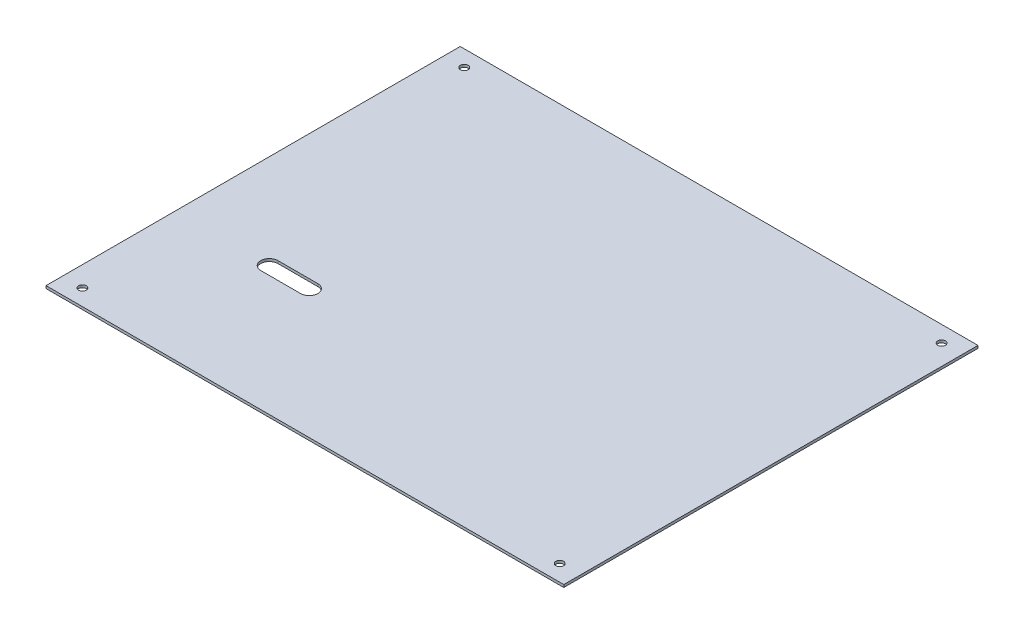
ISO-10303-21;
HEADER;
FILE_DESCRIPTION(('STEP AP214'),'2;1');
FILE_NAME('part.step','',(''),(''),'','','');
FILE_SCHEMA(('AUTOMOTIVE_DESIGN { 1 0 10303 214 1 1 1 1 }'));
ENDSEC;
DATA;
#1=APPLICATION_CONTEXT('core data for automotive mechanical design processes');
#2=APPLICATION_PROTOCOL_DEFINITION('international standard','automotive_design',2000,#1);
#3=PRODUCT_CONTEXT('',#1,'mechanical');
#4=PRODUCT('Part','Part','',(#3));
#5=PRODUCT_RELATED_PRODUCT_CATEGORY('part','',(#4));
#6=PRODUCT_DEFINITION_FORMATION('','',#4);
#7=PRODUCT_DEFINITION_CONTEXT('part definition',#1,'design');
#8=PRODUCT_DEFINITION('design','',#6,#7);
#9=PRODUCT_DEFINITION_SHAPE('','',#8);
#10=(LENGTH_UNIT() NAMED_UNIT(*) SI_UNIT(.MILLI.,.METRE.));
#11=(NAMED_UNIT(*) PLANE_ANGLE_UNIT() SI_UNIT($,.RADIAN.));
#12=(NAMED_UNIT(*) SI_UNIT($,.STERADIAN.) SOLID_ANGLE_UNIT());
#13=UNCERTAINTY_MEASURE_WITH_UNIT(LENGTH_MEASURE(1.E-05),#10,'distance_accuracy_value','');
#14=(GEOMETRIC_REPRESENTATION_CONTEXT(3) GLOBAL_UNCERTAINTY_ASSIGNED_CONTEXT((#13)) GLOBAL_UNIT_ASSIGNED_CONTEXT((#10,
#11,#12)) REPRESENTATION_CONTEXT('',''));
#15=CARTESIAN_POINT('',(0.,0.,0.));
#16=DIRECTION('',(0.,0.,1.));
#17=DIRECTION('',(1.,0.,0.));
#18=AXIS2_PLACEMENT_3D('',#15,#16,#17);
#19=CARTESIAN_POINT('',(0.,1.,0.));
#20=DIRECTION('',(0.,-1.,0.));
#21=DIRECTION('',(0.,0.,-1.));
#22=AXIS2_PLACEMENT_3D('',#19,#20,#21);
#23=PLANE('',#22);
#24=CARTESIAN_POINT('',(-92.1913119055697,1.,73.7530495244558));
#25=DIRECTION('',(0.,1.,0.));
#26=DIRECTION('',(0.,0.,1.));
#27=AXIS2_PLACEMENT_3D('',#24,#25,#26);
#28=CIRCLE('',#27,1.5);
#29=CARTESIAN_POINT('',(-92.1913119055697,1.,75.2530495244558));
#30=VERTEX_POINT('',#29);
#31=EDGE_CURVE('E137',#30,#30,#28,.T.);
#32=ORIENTED_EDGE('',*,*,#31,.F.);
#33=EDGE_LOOP('',(#32));
#34=FACE_BOUND('',#33,.T.);
#35=CARTESIAN_POINT('',(92.1913119055697,1.,73.7530495244558));
#36=DIRECTION('',(0.,1.,0.));
#37=DIRECTION('',(0.,0.,1.));
#38=AXIS2_PLACEMENT_3D('',#35,#36,#37);
#39=CIRCLE('',#38,1.5);
#40=CARTESIAN_POINT('',(92.1913119055697,1.,75.2530495244558));
#41=VERTEX_POINT('',#40);
#42=EDGE_CURVE('E143',#41,#41,#39,.T.);
#43=ORIENTED_EDGE('',*,*,#42,.F.);
#44=EDGE_LOOP('',(#43));
#45=FACE_BOUND('',#44,.T.);
#46=CARTESIAN_POINT('',(92.1913119055697,1.,-73.7530495244558));
#47=DIRECTION('',(0.,1.,0.));
#48=DIRECTION('',(0.,0.,1.));
#49=AXIS2_PLACEMENT_3D('',#46,#47,#48);
#50=CIRCLE('',#49,1.5);
#51=CARTESIAN_POINT('',(92.1913119055697,1.,-72.2530495244558));
#52=VERTEX_POINT('',#51);
#53=EDGE_CURVE('E149',#52,#52,#50,.T.);
#54=ORIENTED_EDGE('',*,*,#53,.F.);
#55=EDGE_LOOP('',(#54));
#56=FACE_BOUND('',#55,.T.);
#57=CARTESIAN_POINT('',(-92.1913119055697,1.,-73.7530495244557));
#58=DIRECTION('',(0.,1.,0.));
#59=DIRECTION('',(0.,0.,1.));
#60=AXIS2_PLACEMENT_3D('',#57,#58,#59);
#61=CIRCLE('',#60,1.5);
#62=CARTESIAN_POINT('',(-92.1913119055697,1.,-72.2530495244557));
#63=VERTEX_POINT('',#62);
#64=EDGE_CURVE('E155',#63,#63,#61,.T.);
#65=ORIENTED_EDGE('',*,*,#64,.F.);
#66=EDGE_LOOP('',(#65));
#67=FACE_BOUND('',#66,.T.);
#68=DIRECTION('',(0.,0.,-1.));
#69=VECTOR('',#68,1.);
#70=CARTESIAN_POINT('',(100.,1.,80.));
#71=LINE('',#70,#69);
#72=CARTESIAN_POINT('',(100.,1.,80.));
#73=VERTEX_POINT('',#72);
#74=CARTESIAN_POINT('',(100.,1.,-80.));
#75=VERTEX_POINT('',#74);
#76=EDGE_CURVE('E161',#73,#75,#71,.T.);
#77=ORIENTED_EDGE('',*,*,#76,.T.);
#78=DIRECTION('',(-1.,0.,0.));
#79=VECTOR('',#78,1.);
#80=CARTESIAN_POINT('',(-100.,1.,-80.));
#81=LINE('',#80,#79);
#82=CARTESIAN_POINT('',(-100.,1.,-80.));
#83=VERTEX_POINT('',#82);
#84=EDGE_CURVE('E164',#75,#83,#81,.T.);
#85=ORIENTED_EDGE('',*,*,#84,.T.);
#86=DIRECTION('',(0.,0.,1.));
#87=VECTOR('',#86,1.);
#88=CARTESIAN_POINT('',(-100.,1.,80.));
#89=LINE('',#88,#87);
#90=CARTESIAN_POINT('',(-100.,1.,80.));
#91=VERTEX_POINT('',#90);
#92=EDGE_CURVE('E167',#83,#91,#89,.T.);
#93=ORIENTED_EDGE('',*,*,#92,.T.);
#94=DIRECTION('',(1.,0.,0.));
#95=VECTOR('',#94,1.);
#96=CARTESIAN_POINT('',(-100.,1.,80.));
#97=LINE('',#96,#95);
#98=EDGE_CURVE('E169',#91,#73,#97,.T.);
#99=ORIENTED_EDGE('',*,*,#98,.T.);
#100=EDGE_LOOP('',(#77,#85,#93,#99));
#101=FACE_BOUND('',#100,.T.);
#102=CARTESIAN_POINT('',(-48.1632126740657,1.,30.1576997977134));
#103=DIRECTION('',(0.,1.,0.));
#104=DIRECTION('',(0.,0.,1.));
#105=AXIS2_PLACEMENT_3D('',#102,#103,#104);
#106=CIRCLE('',#105,3.32197802689073);
#107=CARTESIAN_POINT('',(-48.1632126740657,1.,33.4796778246042));
#108=VERTEX_POINT('',#107);
#109=CARTESIAN_POINT('',(-48.1632126740657,1.,26.8357217708227));
#110=VERTEX_POINT('',#109);
#111=EDGE_CURVE('E101',#108,#110,#106,.T.);
#112=ORIENTED_EDGE('',*,*,#111,.F.);
#113=DIRECTION('',(1.,0.,0.));
#114=VECTOR('',#113,1.);
#115=CARTESIAN_POINT('',(-48.1632126740657,1.,33.4796778246042));
#116=LINE('',#115,#114);
#117=CARTESIAN_POINT('',(-63.5601670591989,1.,33.4796778246042));
#118=VERTEX_POINT('',#117);
#119=EDGE_CURVE('E123',#118,#108,#116,.T.);
#120=ORIENTED_EDGE('',*,*,#119,.F.);
#121=CARTESIAN_POINT('',(-63.5601670591989,1.,30.1576997977134));
#122=DIRECTION('',(0.,1.,0.));
#123=DIRECTION('',(0.,0.,1.));
#124=AXIS2_PLACEMENT_3D('',#121,#122,#123);
#125=CIRCLE('',#124,3.32197802689073);
#126=CARTESIAN_POINT('',(-63.5601670591989,1.,26.8357217708227));
#127=VERTEX_POINT('',#126);
#128=EDGE_CURVE('E121',#127,#118,#125,.T.);
#129=ORIENTED_EDGE('',*,*,#128,.F.);
#130=DIRECTION('',(-1.,0.,0.));
#131=VECTOR('',#130,1.);
#132=CARTESIAN_POINT('',(-48.1632126740657,1.,26.8357217708227));
#133=LINE('',#132,#131);
#134=EDGE_CURVE('E109',#110,#127,#133,.T.);
#135=ORIENTED_EDGE('',*,*,#134,.F.);
#136=EDGE_LOOP('',(#112,#120,#129,#135));
#137=FACE_BOUND('',#136,.T.);
#138=ADVANCED_FACE('F36',(#34,#45,#56,#67,#101,#137),#23,.F.);
#139=CARTESIAN_POINT('',(0.,0.,0.));
#140=DIRECTION('',(0.,-1.,0.));
#141=DIRECTION('',(0.,0.,-1.));
#142=AXIS2_PLACEMENT_3D('',#139,#140,#141);
#143=PLANE('',#142);
#144=CARTESIAN_POINT('',(92.1913119055697,0.,73.7530495244558));
#145=DIRECTION('',(0.,1.,0.));
#146=DIRECTION('',(0.,0.,1.));
#147=AXIS2_PLACEMENT_3D('',#144,#145,#146);
#148=CIRCLE('',#147,1.5);
#149=CARTESIAN_POINT('',(92.1913119055697,0.,75.2530495244558));
#150=VERTEX_POINT('',#149);
#151=EDGE_CURVE('E140',#150,#150,#148,.T.);
#152=ORIENTED_EDGE('',*,*,#151,.T.);
#153=EDGE_LOOP('',(#152));
#154=FACE_BOUND('',#153,.T.);
#155=CARTESIAN_POINT('',(-92.1913119055697,0.,-73.7530495244557));
#156=DIRECTION('',(0.,1.,0.));
#157=DIRECTION('',(0.,0.,1.));
#158=AXIS2_PLACEMENT_3D('',#155,#156,#157);
#159=CIRCLE('',#158,1.5);
#160=CARTESIAN_POINT('',(-92.1913119055697,0.,-72.2530495244557));
#161=VERTEX_POINT('',#160);
#162=EDGE_CURVE('E152',#161,#161,#159,.T.);
#163=ORIENTED_EDGE('',*,*,#162,.T.);
#164=EDGE_LOOP('',(#163));
#165=FACE_BOUND('',#164,.T.);
#166=DIRECTION('',(0.,0.,-1.));
#167=VECTOR('',#166,1.);
#168=CARTESIAN_POINT('',(100.,0.,80.));
#169=LINE('',#168,#167);
#170=CARTESIAN_POINT('',(100.,0.,80.));
#171=VERTEX_POINT('',#170);
#172=CARTESIAN_POINT('',(100.,0.,-80.));
#173=VERTEX_POINT('',#172);
#174=EDGE_CURVE('E158',#171,#173,#169,.T.);
#175=ORIENTED_EDGE('',*,*,#174,.F.);
#176=DIRECTION('',(1.,0.,0.));
#177=VECTOR('',#176,1.);
#178=CARTESIAN_POINT('',(-100.,0.,80.));
#179=LINE('',#178,#177);
#180=CARTESIAN_POINT('',(-100.,0.,80.));
#181=VERTEX_POINT('',#180);
#182=EDGE_CURVE('E165',#181,#171,#179,.T.);
#183=ORIENTED_EDGE('',*,*,#182,.F.);
#184=DIRECTION('',(0.,0.,1.));
#185=VECTOR('',#184,1.);
#186=CARTESIAN_POINT('',(-100.,0.,80.));
#187=LINE('',#186,#185);
#188=CARTESIAN_POINT('',(-100.,0.,-80.));
#189=VERTEX_POINT('',#188);
#190=EDGE_CURVE('E176',#189,#181,#187,.T.);
#191=ORIENTED_EDGE('',*,*,#190,.F.);
#192=DIRECTION('',(-1.,0.,0.));
#193=VECTOR('',#192,1.);
#194=CARTESIAN_POINT('',(-100.,0.,-80.));
#195=LINE('',#194,#193);
#196=EDGE_CURVE('E174',#173,#189,#195,.T.);
#197=ORIENTED_EDGE('',*,*,#196,.F.);
#198=EDGE_LOOP('',(#175,#183,#191,#197));
#199=FACE_BOUND('',#198,.T.);
#200=CARTESIAN_POINT('',(92.1913119055697,0.,-73.7530495244558));
#201=DIRECTION('',(0.,1.,0.));
#202=DIRECTION('',(0.,0.,1.));
#203=AXIS2_PLACEMENT_3D('',#200,#201,#202);
#204=CIRCLE('',#203,1.5);
#205=CARTESIAN_POINT('',(92.1913119055697,0.,-72.2530495244558));
#206=VERTEX_POINT('',#205);
#207=EDGE_CURVE('E146',#206,#206,#204,.T.);
#208=ORIENTED_EDGE('',*,*,#207,.T.);
#209=EDGE_LOOP('',(#208));
#210=FACE_BOUND('',#209,.T.);
#211=CARTESIAN_POINT('',(-92.1913119055697,0.,73.7530495244558));
#212=DIRECTION('',(0.,1.,0.));
#213=DIRECTION('',(0.,0.,1.));
#214=AXIS2_PLACEMENT_3D('',#211,#212,#213);
#215=CIRCLE('',#214,1.5);
#216=CARTESIAN_POINT('',(-92.1913119055697,0.,75.2530495244558));
#217=VERTEX_POINT('',#216);
#218=EDGE_CURVE('E117',#217,#217,#215,.T.);
#219=ORIENTED_EDGE('',*,*,#218,.T.);
#220=EDGE_LOOP('',(#219));
#221=FACE_BOUND('',#220,.T.);
#222=DIRECTION('',(1.,0.,0.));
#223=VECTOR('',#222,1.);
#224=CARTESIAN_POINT('',(-48.1632126740657,0.,33.4796778246042));
#225=LINE('',#224,#223);
#226=CARTESIAN_POINT('',(-63.5601670591989,0.,33.4796778246042));
#227=VERTEX_POINT('',#226);
#228=CARTESIAN_POINT('',(-48.1632126740657,0.,33.4796778246042));
#229=VERTEX_POINT('',#228);
#230=EDGE_CURVE('E110',#227,#229,#225,.T.);
#231=ORIENTED_EDGE('',*,*,#230,.T.);
#232=CARTESIAN_POINT('',(-48.1632126740657,0.,30.1576997977134));
#233=DIRECTION('',(0.,1.,0.));
#234=DIRECTION('',(0.,0.,1.));
#235=AXIS2_PLACEMENT_3D('',#232,#233,#234);
#236=CIRCLE('',#235,3.32197802689073);
#237=CARTESIAN_POINT('',(-48.1632126740657,0.,26.8357217708227));
#238=VERTEX_POINT('',#237);
#239=EDGE_CURVE('E59',#229,#238,#236,.T.);
#240=ORIENTED_EDGE('',*,*,#239,.T.);
#241=DIRECTION('',(-1.,0.,0.));
#242=VECTOR('',#241,1.);
#243=CARTESIAN_POINT('',(-48.1632126740657,0.,26.8357217708227));
#244=LINE('',#243,#242);
#245=CARTESIAN_POINT('',(-63.5601670591989,0.,26.8357217708227));
#246=VERTEX_POINT('',#245);
#247=EDGE_CURVE('E116',#238,#246,#244,.T.);
#248=ORIENTED_EDGE('',*,*,#247,.T.);
#249=CARTESIAN_POINT('',(-63.5601670591989,0.,30.1576997977134));
#250=DIRECTION('',(0.,1.,0.));
#251=DIRECTION('',(0.,0.,1.));
#252=AXIS2_PLACEMENT_3D('',#249,#250,#251);
#253=CIRCLE('',#252,3.32197802689073);
#254=EDGE_CURVE('E129',#246,#227,#253,.T.);
#255=ORIENTED_EDGE('',*,*,#254,.T.);
#256=EDGE_LOOP('',(#231,#240,#248,#255));
#257=FACE_BOUND('',#256,.T.);
#258=ADVANCED_FACE('F194',(#154,#165,#199,#210,#221,#257),#143,.T.);
#259=CARTESIAN_POINT('',(100.,1.,80.));
#260=DIRECTION('',(-1.,0.,0.));
#261=DIRECTION('',(0.,0.,1.));
#262=AXIS2_PLACEMENT_3D('',#259,#260,#261);
#263=PLANE('',#262);
#264=ORIENTED_EDGE('',*,*,#174,.T.);
#265=DIRECTION('',(0.,-1.,0.));
#266=VECTOR('',#265,1.);
#267=CARTESIAN_POINT('',(100.,1.,-80.));
#268=LINE('',#267,#266);
#269=EDGE_CURVE('E11',#75,#173,#268,.T.);
#270=ORIENTED_EDGE('',*,*,#269,.F.);
#271=ORIENTED_EDGE('',*,*,#76,.F.);
#272=DIRECTION('',(0.,-1.,0.));
#273=VECTOR('',#272,1.);
#274=CARTESIAN_POINT('',(100.,1.,80.));
#275=LINE('',#274,#273);
#276=EDGE_CURVE('E171',#73,#171,#275,.T.);
#277=ORIENTED_EDGE('',*,*,#276,.T.);
#278=EDGE_LOOP('',(#264,#270,#271,#277));
#279=FACE_BOUND('',#278,.T.);
#280=ADVANCED_FACE('F38',(#279),#263,.F.);
#281=CARTESIAN_POINT('',(-100.,1.,-80.));
#282=DIRECTION('',(0.,0.,1.));
#283=DIRECTION('',(1.,0.,0.));
#284=AXIS2_PLACEMENT_3D('',#281,#282,#283);
#285=PLANE('',#284);
#286=ORIENTED_EDGE('',*,*,#196,.T.);
#287=DIRECTION('',(0.,-1.,0.));
#288=VECTOR('',#287,1.);
#289=CARTESIAN_POINT('',(-100.,1.,-80.));
#290=LINE('',#289,#288);
#291=EDGE_CURVE('E44',#83,#189,#290,.T.);
#292=ORIENTED_EDGE('',*,*,#291,.F.);
#293=ORIENTED_EDGE('',*,*,#84,.F.);
#294=ORIENTED_EDGE('',*,*,#269,.T.);
#295=EDGE_LOOP('',(#286,#292,#293,#294));
#296=FACE_BOUND('',#295,.T.);
#297=ADVANCED_FACE('F204',(#296),#285,.F.);
#298=CARTESIAN_POINT('',(-100.,1.,80.));
#299=DIRECTION('',(1.,0.,0.));
#300=DIRECTION('',(0.,0.,-1.));
#301=AXIS2_PLACEMENT_3D('',#298,#299,#300);
#302=PLANE('',#301);
#303=ORIENTED_EDGE('',*,*,#190,.T.);
#304=DIRECTION('',(0.,-1.,0.));
#305=VECTOR('',#304,1.);
#306=CARTESIAN_POINT('',(-100.,1.,80.));
#307=LINE('',#306,#305);
#308=EDGE_CURVE('E181',#91,#181,#307,.T.);
#309=ORIENTED_EDGE('',*,*,#308,.F.);
#310=ORIENTED_EDGE('',*,*,#92,.F.);
#311=ORIENTED_EDGE('',*,*,#291,.T.);
#312=EDGE_LOOP('',(#303,#309,#310,#311));
#313=FACE_BOUND('',#312,.T.);
#314=ADVANCED_FACE('F188',(#313),#302,.F.);
#315=CARTESIAN_POINT('',(-100.,1.,80.));
#316=DIRECTION('',(0.,0.,-1.));
#317=DIRECTION('',(-1.,0.,0.));
#318=AXIS2_PLACEMENT_3D('',#315,#316,#317);
#319=PLANE('',#318);
#320=ORIENTED_EDGE('',*,*,#182,.T.);
#321=ORIENTED_EDGE('',*,*,#276,.F.);
#322=ORIENTED_EDGE('',*,*,#98,.F.);
#323=ORIENTED_EDGE('',*,*,#308,.T.);
#324=EDGE_LOOP('',(#320,#321,#322,#323));
#325=FACE_BOUND('',#324,.T.);
#326=ADVANCED_FACE('F198',(#325),#319,.F.);
#327=CARTESIAN_POINT('',(-92.1913119055697,1.,-73.7530495244557));
#328=DIRECTION('',(0.,-1.,0.));
#329=DIRECTION('',(0.,0.,-1.));
#330=AXIS2_PLACEMENT_3D('',#327,#328,#329);
#331=CYLINDRICAL_SURFACE('',#330,1.5);
#332=ORIENTED_EDGE('',*,*,#64,.T.);
#333=EDGE_LOOP('',(#332));
#334=FACE_BOUND('',#333,.T.);
#335=ORIENTED_EDGE('',*,*,#162,.F.);
#336=EDGE_LOOP('',(#335));
#337=FACE_BOUND('',#336,.T.);
#338=ADVANCED_FACE('F222',(#334,#337),#331,.F.);
#339=CARTESIAN_POINT('',(92.1913119055697,1.,-73.7530495244558));
#340=DIRECTION('',(0.,-1.,0.));
#341=DIRECTION('',(0.,0.,-1.));
#342=AXIS2_PLACEMENT_3D('',#339,#340,#341);
#343=CYLINDRICAL_SURFACE('',#342,1.5);
#344=ORIENTED_EDGE('',*,*,#53,.T.);
#345=EDGE_LOOP('',(#344));
#346=FACE_BOUND('',#345,.T.);
#347=ORIENTED_EDGE('',*,*,#207,.F.);
#348=EDGE_LOOP('',(#347));
#349=FACE_BOUND('',#348,.T.);
#350=ADVANCED_FACE('F229',(#346,#349),#343,.F.);
#351=CARTESIAN_POINT('',(92.1913119055697,1.,73.7530495244558));
#352=DIRECTION('',(0.,-1.,0.));
#353=DIRECTION('',(0.,0.,-1.));
#354=AXIS2_PLACEMENT_3D('',#351,#352,#353);
#355=CYLINDRICAL_SURFACE('',#354,1.5);
#356=ORIENTED_EDGE('',*,*,#42,.T.);
#357=EDGE_LOOP('',(#356));
#358=FACE_BOUND('',#357,.T.);
#359=ORIENTED_EDGE('',*,*,#151,.F.);
#360=EDGE_LOOP('',(#359));
#361=FACE_BOUND('',#360,.T.);
#362=ADVANCED_FACE('F234',(#358,#361),#355,.F.);
#363=CARTESIAN_POINT('',(-92.1913119055697,1.,73.7530495244558));
#364=DIRECTION('',(0.,-1.,0.));
#365=DIRECTION('',(0.,0.,-1.));
#366=AXIS2_PLACEMENT_3D('',#363,#364,#365);
#367=CYLINDRICAL_SURFACE('',#366,1.5);
#368=ORIENTED_EDGE('',*,*,#31,.T.);
#369=EDGE_LOOP('',(#368));
#370=FACE_BOUND('',#369,.T.);
#371=ORIENTED_EDGE('',*,*,#218,.F.);
#372=EDGE_LOOP('',(#371));
#373=FACE_BOUND('',#372,.T.);
#374=ADVANCED_FACE('F244',(#370,#373),#367,.F.);
#375=CARTESIAN_POINT('',(-48.1632126740657,1.,30.1576997977134));
#376=DIRECTION('',(0.,-1.,0.));
#377=DIRECTION('',(0.,0.,-1.));
#378=AXIS2_PLACEMENT_3D('',#375,#376,#377);
#379=CYLINDRICAL_SURFACE('',#378,3.32197802689073);
#380=ORIENTED_EDGE('',*,*,#239,.F.);
#381=DIRECTION('',(0.,-1.,0.));
#382=VECTOR('',#381,1.);
#383=CARTESIAN_POINT('',(-48.1632126740657,1.,33.4796778246042));
#384=LINE('',#383,#382);
#385=EDGE_CURVE('E105',#108,#229,#384,.T.);
#386=ORIENTED_EDGE('',*,*,#385,.F.);
#387=ORIENTED_EDGE('',*,*,#111,.T.);
#388=DIRECTION('',(0.,-1.,0.));
#389=VECTOR('',#388,1.);
#390=CARTESIAN_POINT('',(-48.1632126740657,1.,26.8357217708227));
#391=LINE('',#390,#389);
#392=EDGE_CURVE('E104',#110,#238,#391,.T.);
#393=ORIENTED_EDGE('',*,*,#392,.T.);
#394=EDGE_LOOP('',(#380,#386,#387,#393));
#395=FACE_BOUND('',#394,.T.);
#396=ADVANCED_FACE('F103',(#395),#379,.F.);
#397=CARTESIAN_POINT('',(-48.1632126740657,1.,26.8357217708227));
#398=DIRECTION('',(0.,0.,1.));
#399=DIRECTION('',(1.,0.,0.));
#400=AXIS2_PLACEMENT_3D('',#397,#398,#399);
#401=PLANE('',#400);
#402=ORIENTED_EDGE('',*,*,#247,.F.);
#403=ORIENTED_EDGE('',*,*,#392,.F.);
#404=ORIENTED_EDGE('',*,*,#134,.T.);
#405=DIRECTION('',(0.,-1.,0.));
#406=VECTOR('',#405,1.);
#407=CARTESIAN_POINT('',(-63.5601670591989,1.,26.8357217708227));
#408=LINE('',#407,#406);
#409=EDGE_CURVE('E118',#127,#246,#408,.T.);
#410=ORIENTED_EDGE('',*,*,#409,.T.);
#411=EDGE_LOOP('',(#402,#403,#404,#410));
#412=FACE_BOUND('',#411,.T.);
#413=ADVANCED_FACE('F113',(#412),#401,.T.);
#414=CARTESIAN_POINT('',(-63.5601670591989,1.,30.1576997977134));
#415=DIRECTION('',(0.,-1.,0.));
#416=DIRECTION('',(0.,0.,-1.));
#417=AXIS2_PLACEMENT_3D('',#414,#415,#416);
#418=CYLINDRICAL_SURFACE('',#417,3.32197802689073);
#419=ORIENTED_EDGE('',*,*,#254,.F.);
#420=ORIENTED_EDGE('',*,*,#409,.F.);
#421=ORIENTED_EDGE('',*,*,#128,.T.);
#422=DIRECTION('',(0.,-1.,0.));
#423=VECTOR('',#422,1.);
#424=CARTESIAN_POINT('',(-63.5601670591989,1.,33.4796778246042));
#425=LINE('',#424,#423);
#426=EDGE_CURVE('E51',#118,#227,#425,.T.);
#427=ORIENTED_EDGE('',*,*,#426,.T.);
#428=EDGE_LOOP('',(#419,#420,#421,#427));
#429=FACE_BOUND('',#428,.T.);
#430=ADVANCED_FACE('F256',(#429),#418,.F.);
#431=CARTESIAN_POINT('',(-48.1632126740657,1.,33.4796778246042));
#432=DIRECTION('',(0.,0.,-1.));
#433=DIRECTION('',(-1.,0.,0.));
#434=AXIS2_PLACEMENT_3D('',#431,#432,#433);
#435=PLANE('',#434);
#436=ORIENTED_EDGE('',*,*,#230,.F.);
#437=ORIENTED_EDGE('',*,*,#426,.F.);
#438=ORIENTED_EDGE('',*,*,#119,.T.);
#439=ORIENTED_EDGE('',*,*,#385,.T.);
#440=EDGE_LOOP('',(#436,#437,#438,#439));
#441=FACE_BOUND('',#440,.T.);
#442=ADVANCED_FACE('F259',(#441),#435,.T.);
#443=CLOSED_SHELL('',(#138,#258,#280,#297,#314,#326,#338,#350,#362,#374,#396,#413,#430,#442));
#444=MANIFOLD_SOLID_BREP('B2',#443);
#445=ADVANCED_BREP_SHAPE_REPRESENTATION('',(#18,#444),#14);
#446=SHAPE_DEFINITION_REPRESENTATION(#9,#445);
ENDSEC;
END-ISO-10303-21;
